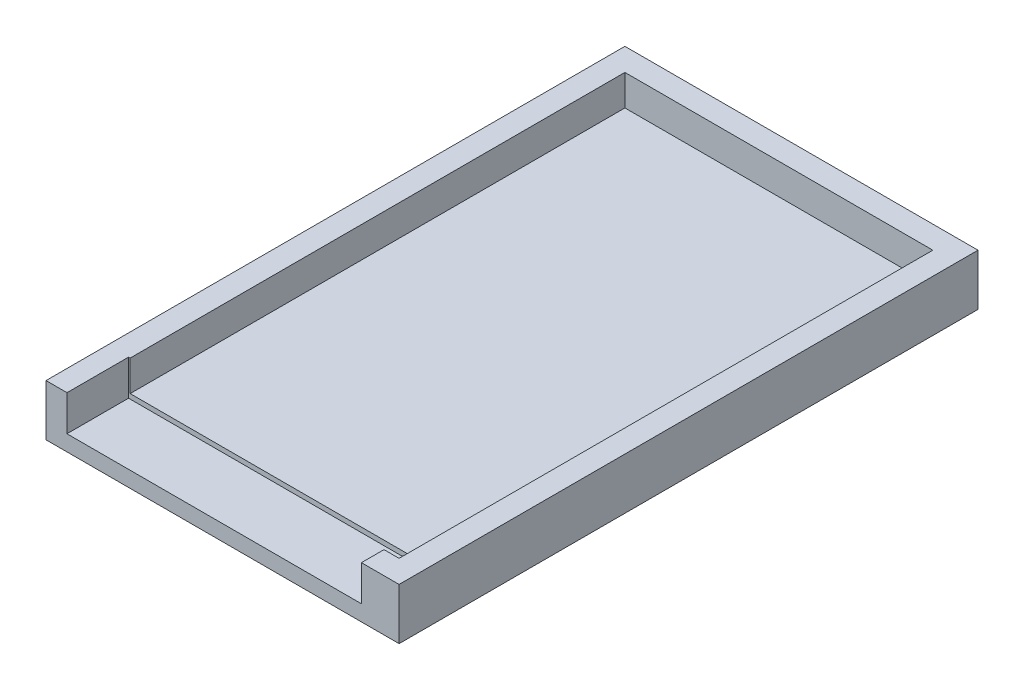
ISO-10303-21;
HEADER;
FILE_DESCRIPTION(('STEP AP214'),'2;1');
FILE_NAME('part.step','',(''),(''),'','','');
FILE_SCHEMA(('AUTOMOTIVE_DESIGN { 1 0 10303 214 1 1 1 1 }'));
ENDSEC;
DATA;
#1=APPLICATION_CONTEXT('core data for automotive mechanical design processes');
#2=APPLICATION_PROTOCOL_DEFINITION('international standard','automotive_design',2000,#1);
#3=PRODUCT_CONTEXT('',#1,'mechanical');
#4=PRODUCT('Part','Part','',(#3));
#5=PRODUCT_RELATED_PRODUCT_CATEGORY('part','',(#4));
#6=PRODUCT_DEFINITION_FORMATION('','',#4);
#7=PRODUCT_DEFINITION_CONTEXT('part definition',#1,'design');
#8=PRODUCT_DEFINITION('design','',#6,#7);
#9=PRODUCT_DEFINITION_SHAPE('','',#8);
#10=(LENGTH_UNIT() NAMED_UNIT(*) SI_UNIT(.MILLI.,.METRE.));
#11=(NAMED_UNIT(*) PLANE_ANGLE_UNIT() SI_UNIT($,.RADIAN.));
#12=(NAMED_UNIT(*) SI_UNIT($,.STERADIAN.) SOLID_ANGLE_UNIT());
#13=UNCERTAINTY_MEASURE_WITH_UNIT(LENGTH_MEASURE(1.E-05),#10,'distance_accuracy_value','');
#14=(GEOMETRIC_REPRESENTATION_CONTEXT(3) GLOBAL_UNCERTAINTY_ASSIGNED_CONTEXT((#13)) GLOBAL_UNIT_ASSIGNED_CONTEXT((#10,
#11,#12)) REPRESENTATION_CONTEXT('',''));
#15=CARTESIAN_POINT('',(0.,0.,0.));
#16=DIRECTION('',(0.,0.,1.));
#17=DIRECTION('',(1.,0.,0.));
#18=AXIS2_PLACEMENT_3D('',#15,#16,#17);
#19=CARTESIAN_POINT('',(0.,2.,0.));
#20=DIRECTION('',(0.,-1.,0.));
#21=DIRECTION('',(0.,0.,-1.));
#22=AXIS2_PLACEMENT_3D('',#19,#20,#21);
#23=PLANE('',#22);
#24=DIRECTION('',(1.,0.,0.));
#25=VECTOR('',#24,1.);
#26=CARTESIAN_POINT('',(0.,2.,22.2));
#27=LINE('',#26,#25);
#28=CARTESIAN_POINT('',(-15.,2.,22.2));
#29=VERTEX_POINT('',#28);
#30=CARTESIAN_POINT('',(13.5295329738902,2.,22.2));
#31=VERTEX_POINT('',#30);
#32=EDGE_CURVE('E172',#29,#31,#27,.T.);
#33=ORIENTED_EDGE('',*,*,#32,.T.);
#34=DIRECTION('',(0.,0.,1.));
#35=VECTOR('',#34,1.);
#36=CARTESIAN_POINT('',(13.5295329738902,2.,0.));
#37=LINE('',#36,#35);
#38=CARTESIAN_POINT('',(13.5295329738902,2.,26.));
#39=VERTEX_POINT('',#38);
#40=EDGE_CURVE('E167',#31,#39,#37,.T.);
#41=ORIENTED_EDGE('',*,*,#40,.T.);
#42=DIRECTION('',(1.,0.,0.));
#43=VECTOR('',#42,1.);
#44=CARTESIAN_POINT('',(-15.,2.,26.));
#45=LINE('',#44,#43);
#46=CARTESIAN_POINT('',(15.,2.,26.));
#47=VERTEX_POINT('',#46);
#48=EDGE_CURVE('E226',#39,#47,#45,.T.);
#49=ORIENTED_EDGE('',*,*,#48,.T.);
#50=DIRECTION('',(0.,0.,1.));
#51=VECTOR('',#50,1.);
#52=CARTESIAN_POINT('',(15.,2.,-26.));
#53=LINE('',#52,#51);
#54=CARTESIAN_POINT('',(15.,2.,-26.));
#55=VERTEX_POINT('',#54);
#56=EDGE_CURVE('E228',#55,#47,#53,.T.);
#57=ORIENTED_EDGE('',*,*,#56,.F.);
#58=DIRECTION('',(1.,0.,0.));
#59=VECTOR('',#58,1.);
#60=CARTESIAN_POINT('',(-15.,2.,-26.));
#61=LINE('',#60,#59);
#62=CARTESIAN_POINT('',(-15.,2.,-26.));
#63=VERTEX_POINT('',#62);
#64=EDGE_CURVE('E62',#63,#55,#61,.T.);
#65=ORIENTED_EDGE('',*,*,#64,.F.);
#66=DIRECTION('',(0.,0.,1.));
#67=VECTOR('',#66,1.);
#68=CARTESIAN_POINT('',(-15.,2.,-26.));
#69=LINE('',#68,#67);
#70=EDGE_CURVE('E232',#63,#29,#69,.T.);
#71=ORIENTED_EDGE('',*,*,#70,.T.);
#72=EDGE_LOOP('',(#33,#41,#49,#57,#65,#71));
#73=FACE_BOUND('',#72,.T.);
#74=ADVANCED_FACE('F39',(#73),#23,.F.);
#75=CARTESIAN_POINT('',(-15.,5.,-26.));
#76=DIRECTION('',(1.,0.,0.));
#77=DIRECTION('',(0.,0.,-1.));
#78=AXIS2_PLACEMENT_3D('',#75,#76,#77);
#79=PLANE('',#78);
#80=DIRECTION('',(0.,1.,0.));
#81=VECTOR('',#80,1.);
#82=CARTESIAN_POINT('',(-15.,5.,22.2));
#83=LINE('',#82,#81);
#84=CARTESIAN_POINT('',(-15.,5.,22.2));
#85=VERTEX_POINT('',#84);
#86=EDGE_CURVE('E170',#29,#85,#83,.T.);
#87=ORIENTED_EDGE('',*,*,#86,.F.);
#88=ORIENTED_EDGE('',*,*,#70,.F.);
#89=DIRECTION('',(0.,-1.,0.));
#90=VECTOR('',#89,1.);
#91=CARTESIAN_POINT('',(-15.,5.,-26.));
#92=LINE('',#91,#90);
#93=CARTESIAN_POINT('',(-15.,5.,-26.));
#94=VERTEX_POINT('',#93);
#95=EDGE_CURVE('E185',#94,#63,#92,.T.);
#96=ORIENTED_EDGE('',*,*,#95,.F.);
#97=DIRECTION('',(0.,0.,1.));
#98=VECTOR('',#97,1.);
#99=CARTESIAN_POINT('',(-15.,5.,-26.));
#100=LINE('',#99,#98);
#101=EDGE_CURVE('E175',#94,#85,#100,.T.);
#102=ORIENTED_EDGE('',*,*,#101,.T.);
#103=EDGE_LOOP('',(#87,#88,#96,#102));
#104=FACE_BOUND('',#103,.T.);
#105=ADVANCED_FACE('F268',(#104),#79,.T.);
#106=CARTESIAN_POINT('',(-15.,5.,26.));
#107=DIRECTION('',(0.,0.,-1.));
#108=DIRECTION('',(-1.,0.,0.));
#109=AXIS2_PLACEMENT_3D('',#106,#107,#108);
#110=PLANE('',#109);
#111=DIRECTION('',(0.,-1.,0.));
#112=VECTOR('',#111,1.);
#113=CARTESIAN_POINT('',(13.5295329738902,5.,26.));
#114=LINE('',#113,#112);
#115=CARTESIAN_POINT('',(13.5295329738902,5.,26.));
#116=VERTEX_POINT('',#115);
#117=EDGE_CURVE('E165',#116,#39,#114,.T.);
#118=ORIENTED_EDGE('',*,*,#117,.F.);
#119=DIRECTION('',(1.,0.,0.));
#120=VECTOR('',#119,1.);
#121=CARTESIAN_POINT('',(-15.,5.,26.));
#122=LINE('',#121,#120);
#123=CARTESIAN_POINT('',(15.,5.,26.));
#124=VERTEX_POINT('',#123);
#125=EDGE_CURVE('E178',#116,#124,#122,.T.);
#126=ORIENTED_EDGE('',*,*,#125,.T.);
#127=DIRECTION('',(0.,-1.,0.));
#128=VECTOR('',#127,1.);
#129=CARTESIAN_POINT('',(15.,5.,26.));
#130=LINE('',#129,#128);
#131=EDGE_CURVE('E191',#124,#47,#130,.T.);
#132=ORIENTED_EDGE('',*,*,#131,.T.);
#133=ORIENTED_EDGE('',*,*,#48,.F.);
#134=EDGE_LOOP('',(#118,#126,#132,#133));
#135=FACE_BOUND('',#134,.T.);
#136=ADVANCED_FACE('F273',(#135),#110,.T.);
#137=CARTESIAN_POINT('',(15.,5.,-26.));
#138=DIRECTION('',(-1.,0.,0.));
#139=DIRECTION('',(0.,0.,1.));
#140=AXIS2_PLACEMENT_3D('',#137,#138,#139);
#141=PLANE('',#140);
#142=ORIENTED_EDGE('',*,*,#56,.T.);
#143=ORIENTED_EDGE('',*,*,#131,.F.);
#144=DIRECTION('',(0.,0.,-1.));
#145=VECTOR('',#144,1.);
#146=CARTESIAN_POINT('',(15.,5.,-26.));
#147=LINE('',#146,#145);
#148=CARTESIAN_POINT('',(15.,5.,-26.));
#149=VERTEX_POINT('',#148);
#150=EDGE_CURVE('E180',#124,#149,#147,.T.);
#151=ORIENTED_EDGE('',*,*,#150,.T.);
#152=DIRECTION('',(0.,-1.,0.));
#153=VECTOR('',#152,1.);
#154=CARTESIAN_POINT('',(15.,5.,-26.));
#155=LINE('',#154,#153);
#156=EDGE_CURVE('E188',#149,#55,#155,.T.);
#157=ORIENTED_EDGE('',*,*,#156,.T.);
#158=EDGE_LOOP('',(#142,#143,#151,#157));
#159=FACE_BOUND('',#158,.T.);
#160=ADVANCED_FACE('F285',(#159),#141,.T.);
#161=CARTESIAN_POINT('',(-15.,5.,-26.));
#162=DIRECTION('',(0.,0.,1.));
#163=DIRECTION('',(1.,0.,0.));
#164=AXIS2_PLACEMENT_3D('',#161,#162,#163);
#165=PLANE('',#164);
#166=ORIENTED_EDGE('',*,*,#64,.T.);
#167=ORIENTED_EDGE('',*,*,#156,.F.);
#168=DIRECTION('',(-1.,0.,0.));
#169=VECTOR('',#168,1.);
#170=CARTESIAN_POINT('',(-15.,5.,-26.));
#171=LINE('',#170,#169);
#172=EDGE_CURVE('E183',#149,#94,#171,.T.);
#173=ORIENTED_EDGE('',*,*,#172,.T.);
#174=ORIENTED_EDGE('',*,*,#95,.T.);
#175=EDGE_LOOP('',(#166,#167,#173,#174));
#176=FACE_BOUND('',#175,.T.);
#177=ADVANCED_FACE('F265',(#176),#165,.T.);
#178=CARTESIAN_POINT('',(0.,5.,0.));
#179=DIRECTION('',(0.,-1.,0.));
#180=DIRECTION('',(0.,0.,-1.));
#181=AXIS2_PLACEMENT_3D('',#178,#179,#180);
#182=PLANE('',#181);
#183=ORIENTED_EDGE('',*,*,#125,.F.);
#184=DIRECTION('',(0.,0.,1.));
#185=VECTOR('',#184,1.);
#186=CARTESIAN_POINT('',(13.5295329738902,5.,0.));
#187=LINE('',#186,#185);
#188=CARTESIAN_POINT('',(13.5295329738902,5.,28.2));
#189=VERTEX_POINT('',#188);
#190=EDGE_CURVE('E162',#116,#189,#187,.T.);
#191=ORIENTED_EDGE('',*,*,#190,.T.);
#192=DIRECTION('',(1.,0.,0.));
#193=VECTOR('',#192,1.);
#194=CARTESIAN_POINT('',(-17.2,5.,28.2));
#195=LINE('',#194,#193);
#196=CARTESIAN_POINT('',(17.2,5.,28.2));
#197=VERTEX_POINT('',#196);
#198=EDGE_CURVE('E201',#189,#197,#195,.T.);
#199=ORIENTED_EDGE('',*,*,#198,.T.);
#200=DIRECTION('',(0.,0.,-1.));
#201=VECTOR('',#200,1.);
#202=CARTESIAN_POINT('',(17.2,5.,-28.2));
#203=LINE('',#202,#201);
#204=CARTESIAN_POINT('',(17.2,5.,-28.2));
#205=VERTEX_POINT('',#204);
#206=EDGE_CURVE('E205',#197,#205,#203,.T.);
#207=ORIENTED_EDGE('',*,*,#206,.T.);
#208=DIRECTION('',(-1.,0.,0.));
#209=VECTOR('',#208,1.);
#210=CARTESIAN_POINT('',(-17.2,5.,-28.2));
#211=LINE('',#210,#209);
#212=CARTESIAN_POINT('',(-17.2,5.,-28.2));
#213=VERTEX_POINT('',#212);
#214=EDGE_CURVE('E195',#205,#213,#211,.T.);
#215=ORIENTED_EDGE('',*,*,#214,.T.);
#216=DIRECTION('',(0.,0.,1.));
#217=VECTOR('',#216,1.);
#218=CARTESIAN_POINT('',(-17.2,5.,-28.2));
#219=LINE('',#218,#217);
#220=CARTESIAN_POINT('',(-17.2,5.,28.2));
#221=VERTEX_POINT('',#220);
#222=EDGE_CURVE('E198',#213,#221,#219,.T.);
#223=ORIENTED_EDGE('',*,*,#222,.T.);
#224=CARTESIAN_POINT('',(-15.1561862278402,5.,28.2));
#225=VERTEX_POINT('',#224);
#226=EDGE_CURVE('E202',#221,#225,#195,.T.);
#227=ORIENTED_EDGE('',*,*,#226,.T.);
#228=DIRECTION('',(0.,0.,-1.));
#229=VECTOR('',#228,1.);
#230=CARTESIAN_POINT('',(-15.1561862278402,5.,0.));
#231=LINE('',#230,#229);
#232=CARTESIAN_POINT('',(-15.1561862278402,5.,22.2));
#233=VERTEX_POINT('',#232);
#234=EDGE_CURVE('E54',#225,#233,#231,.T.);
#235=ORIENTED_EDGE('',*,*,#234,.T.);
#236=DIRECTION('',(1.,0.,0.));
#237=VECTOR('',#236,1.);
#238=CARTESIAN_POINT('',(0.,5.,22.2));
#239=LINE('',#238,#237);
#240=EDGE_CURVE('E11',#233,#85,#239,.T.);
#241=ORIENTED_EDGE('',*,*,#240,.T.);
#242=ORIENTED_EDGE('',*,*,#101,.F.);
#243=ORIENTED_EDGE('',*,*,#172,.F.);
#244=ORIENTED_EDGE('',*,*,#150,.F.);
#245=EDGE_LOOP('',(#183,#191,#199,#207,#215,#223,#227,#235,#241,#242,#243,#244));
#246=FACE_BOUND('',#245,.T.);
#247=ADVANCED_FACE('F240',(#246),#182,.F.);
#248=CARTESIAN_POINT('',(-17.2,5.,-28.2));
#249=DIRECTION('',(0.,0.,1.));
#250=DIRECTION('',(1.,0.,0.));
#251=AXIS2_PLACEMENT_3D('',#248,#249,#250);
#252=PLANE('',#251);
#253=DIRECTION('',(-1.,0.,0.));
#254=VECTOR('',#253,1.);
#255=CARTESIAN_POINT('',(-17.2,0.,-28.2));
#256=LINE('',#255,#254);
#257=CARTESIAN_POINT('',(17.2,0.,-28.2));
#258=VERTEX_POINT('',#257);
#259=CARTESIAN_POINT('',(-17.2,0.,-28.2));
#260=VERTEX_POINT('',#259);
#261=EDGE_CURVE('E194',#258,#260,#256,.T.);
#262=ORIENTED_EDGE('',*,*,#261,.T.);
#263=DIRECTION('',(0.,-1.,0.));
#264=VECTOR('',#263,1.);
#265=CARTESIAN_POINT('',(-17.2,5.,-28.2));
#266=LINE('',#265,#264);
#267=EDGE_CURVE('E223',#213,#260,#266,.T.);
#268=ORIENTED_EDGE('',*,*,#267,.F.);
#269=ORIENTED_EDGE('',*,*,#214,.F.);
#270=DIRECTION('',(0.,-1.,0.));
#271=VECTOR('',#270,1.);
#272=CARTESIAN_POINT('',(17.2,5.,-28.2));
#273=LINE('',#272,#271);
#274=EDGE_CURVE('E207',#205,#258,#273,.T.);
#275=ORIENTED_EDGE('',*,*,#274,.T.);
#276=EDGE_LOOP('',(#262,#268,#269,#275));
#277=FACE_BOUND('',#276,.T.);
#278=ADVANCED_FACE('F256',(#277),#252,.F.);
#279=CARTESIAN_POINT('',(-17.2,5.,-28.2));
#280=DIRECTION('',(1.,0.,0.));
#281=DIRECTION('',(0.,0.,-1.));
#282=AXIS2_PLACEMENT_3D('',#279,#280,#281);
#283=PLANE('',#282);
#284=DIRECTION('',(0.,0.,1.));
#285=VECTOR('',#284,1.);
#286=CARTESIAN_POINT('',(-17.2,0.,-28.2));
#287=LINE('',#286,#285);
#288=CARTESIAN_POINT('',(-17.2,0.,28.2));
#289=VERTEX_POINT('',#288);
#290=EDGE_CURVE('E210',#260,#289,#287,.T.);
#291=ORIENTED_EDGE('',*,*,#290,.T.);
#292=DIRECTION('',(0.,-1.,0.));
#293=VECTOR('',#292,1.);
#294=CARTESIAN_POINT('',(-17.2,5.,28.2));
#295=LINE('',#294,#293);
#296=EDGE_CURVE('E220',#221,#289,#295,.T.);
#297=ORIENTED_EDGE('',*,*,#296,.F.);
#298=ORIENTED_EDGE('',*,*,#222,.F.);
#299=ORIENTED_EDGE('',*,*,#267,.T.);
#300=EDGE_LOOP('',(#291,#297,#298,#299));
#301=FACE_BOUND('',#300,.T.);
#302=ADVANCED_FACE('F245',(#301),#283,.F.);
#303=CARTESIAN_POINT('',(-17.2,5.,28.2));
#304=DIRECTION('',(0.,0.,-1.));
#305=DIRECTION('',(-1.,0.,0.));
#306=AXIS2_PLACEMENT_3D('',#303,#304,#305);
#307=PLANE('',#306);
#308=ORIENTED_EDGE('',*,*,#198,.F.);
#309=DIRECTION('',(0.,1.,0.));
#310=VECTOR('',#309,1.);
#311=CARTESIAN_POINT('',(13.5295329738902,5.90719360037341,28.2));
#312=LINE('',#311,#310);
#313=CARTESIAN_POINT('',(13.5295329738902,1.53233336391279,28.2));
#314=VERTEX_POINT('',#313);
#315=EDGE_CURVE('E156',#314,#189,#312,.T.);
#316=ORIENTED_EDGE('',*,*,#315,.F.);
#317=DIRECTION('',(1.,0.,0.));
#318=VECTOR('',#317,1.);
#319=CARTESIAN_POINT('',(13.5295329738902,1.53233336391279,28.2));
#320=LINE('',#319,#318);
#321=CARTESIAN_POINT('',(-15.1561862278402,1.53233336391279,28.2));
#322=VERTEX_POINT('',#321);
#323=EDGE_CURVE('E158',#322,#314,#320,.T.);
#324=ORIENTED_EDGE('',*,*,#323,.F.);
#325=DIRECTION('',(0.,1.,0.));
#326=VECTOR('',#325,1.);
#327=CARTESIAN_POINT('',(-15.1561862278402,5.,28.2));
#328=LINE('',#327,#326);
#329=EDGE_CURVE('E47',#322,#225,#328,.T.);
#330=ORIENTED_EDGE('',*,*,#329,.T.);
#331=ORIENTED_EDGE('',*,*,#226,.F.);
#332=ORIENTED_EDGE('',*,*,#296,.T.);
#333=DIRECTION('',(1.,0.,0.));
#334=VECTOR('',#333,1.);
#335=CARTESIAN_POINT('',(-17.2,0.,28.2));
#336=LINE('',#335,#334);
#337=CARTESIAN_POINT('',(17.2,0.,28.2));
#338=VERTEX_POINT('',#337);
#339=EDGE_CURVE('E212',#289,#338,#336,.T.);
#340=ORIENTED_EDGE('',*,*,#339,.T.);
#341=DIRECTION('',(0.,-1.,0.));
#342=VECTOR('',#341,1.);
#343=CARTESIAN_POINT('',(17.2,5.,28.2));
#344=LINE('',#343,#342);
#345=EDGE_CURVE('E217',#197,#338,#344,.T.);
#346=ORIENTED_EDGE('',*,*,#345,.F.);
#347=EDGE_LOOP('',(#308,#316,#324,#330,#331,#332,#340,#346));
#348=FACE_BOUND('',#347,.T.);
#349=ADVANCED_FACE('F236',(#348),#307,.F.);
#350=CARTESIAN_POINT('',(17.2,5.,-28.2));
#351=DIRECTION('',(-1.,0.,0.));
#352=DIRECTION('',(0.,0.,1.));
#353=AXIS2_PLACEMENT_3D('',#350,#351,#352);
#354=PLANE('',#353);
#355=DIRECTION('',(0.,0.,-1.));
#356=VECTOR('',#355,1.);
#357=CARTESIAN_POINT('',(17.2,0.,-28.2));
#358=LINE('',#357,#356);
#359=EDGE_CURVE('E199',#338,#258,#358,.T.);
#360=ORIENTED_EDGE('',*,*,#359,.T.);
#361=ORIENTED_EDGE('',*,*,#274,.F.);
#362=ORIENTED_EDGE('',*,*,#206,.F.);
#363=ORIENTED_EDGE('',*,*,#345,.T.);
#364=EDGE_LOOP('',(#360,#361,#362,#363));
#365=FACE_BOUND('',#364,.T.);
#366=ADVANCED_FACE('F253',(#365),#354,.F.);
#367=CARTESIAN_POINT('',(0.,0.,0.));
#368=DIRECTION('',(0.,-1.,0.));
#369=DIRECTION('',(0.,0.,-1.));
#370=AXIS2_PLACEMENT_3D('',#367,#368,#369);
#371=PLANE('',#370);
#372=ORIENTED_EDGE('',*,*,#261,.F.);
#373=ORIENTED_EDGE('',*,*,#359,.F.);
#374=ORIENTED_EDGE('',*,*,#339,.F.);
#375=ORIENTED_EDGE('',*,*,#290,.F.);
#376=EDGE_LOOP('',(#372,#373,#374,#375));
#377=FACE_BOUND('',#376,.T.);
#378=ADVANCED_FACE('F41',(#377),#371,.T.);
#379=CARTESIAN_POINT('',(0.,0.,22.2));
#380=DIRECTION('',(0.,0.,-1.));
#381=DIRECTION('',(-1.,0.,0.));
#382=AXIS2_PLACEMENT_3D('',#379,#380,#381);
#383=PLANE('',#382);
#384=ORIENTED_EDGE('',*,*,#86,.T.);
#385=ORIENTED_EDGE('',*,*,#240,.F.);
#386=DIRECTION('',(0.,-1.,0.));
#387=VECTOR('',#386,1.);
#388=CARTESIAN_POINT('',(-15.1561862278402,5.90719360037341,22.2));
#389=LINE('',#388,#387);
#390=CARTESIAN_POINT('',(-15.1561862278402,1.53233336391279,22.2));
#391=VERTEX_POINT('',#390);
#392=EDGE_CURVE('E135',#233,#391,#389,.T.);
#393=ORIENTED_EDGE('',*,*,#392,.T.);
#394=DIRECTION('',(1.,0.,0.));
#395=VECTOR('',#394,1.);
#396=CARTESIAN_POINT('',(13.5295329738902,1.53233336391279,22.2));
#397=LINE('',#396,#395);
#398=CARTESIAN_POINT('',(13.5295329738902,1.53233336391279,22.2));
#399=VERTEX_POINT('',#398);
#400=EDGE_CURVE('E140',#391,#399,#397,.T.);
#401=ORIENTED_EDGE('',*,*,#400,.T.);
#402=DIRECTION('',(0.,1.,0.));
#403=VECTOR('',#402,1.);
#404=CARTESIAN_POINT('',(13.5295329738902,5.90719360037341,22.2));
#405=LINE('',#404,#403);
#406=EDGE_CURVE('E141',#399,#31,#405,.T.);
#407=ORIENTED_EDGE('',*,*,#406,.T.);
#408=ORIENTED_EDGE('',*,*,#32,.F.);
#409=EDGE_LOOP('',(#384,#385,#393,#401,#407,#408));
#410=FACE_BOUND('',#409,.T.);
#411=ADVANCED_FACE('F137',(#410),#383,.F.);
#412=CARTESIAN_POINT('',(13.5295329738902,5.90719360037341,22.2));
#413=DIRECTION('',(1.,0.,0.));
#414=DIRECTION('',(0.,0.,-1.));
#415=AXIS2_PLACEMENT_3D('',#412,#413,#414);
#416=PLANE('',#415);
#417=ORIENTED_EDGE('',*,*,#406,.F.);
#418=DIRECTION('',(0.,0.,1.));
#419=VECTOR('',#418,1.);
#420=CARTESIAN_POINT('',(13.5295329738902,1.53233336391279,22.2));
#421=LINE('',#420,#419);
#422=EDGE_CURVE('E149',#399,#314,#421,.T.);
#423=ORIENTED_EDGE('',*,*,#422,.T.);
#424=ORIENTED_EDGE('',*,*,#315,.T.);
#425=ORIENTED_EDGE('',*,*,#190,.F.);
#426=ORIENTED_EDGE('',*,*,#117,.T.);
#427=ORIENTED_EDGE('',*,*,#40,.F.);
#428=EDGE_LOOP('',(#417,#423,#424,#425,#426,#427));
#429=FACE_BOUND('',#428,.T.);
#430=ADVANCED_FACE('F289',(#429),#416,.F.);
#431=CARTESIAN_POINT('',(-15.1561862278402,5.90719360037341,22.2));
#432=DIRECTION('',(-1.,0.,0.));
#433=DIRECTION('',(0.,0.,1.));
#434=AXIS2_PLACEMENT_3D('',#431,#432,#433);
#435=PLANE('',#434);
#436=ORIENTED_EDGE('',*,*,#329,.F.);
#437=DIRECTION('',(0.,0.,1.));
#438=VECTOR('',#437,1.);
#439=CARTESIAN_POINT('',(-15.1561862278402,1.53233336391279,22.2));
#440=LINE('',#439,#438);
#441=EDGE_CURVE('E144',#391,#322,#440,.T.);
#442=ORIENTED_EDGE('',*,*,#441,.F.);
#443=ORIENTED_EDGE('',*,*,#392,.F.);
#444=ORIENTED_EDGE('',*,*,#234,.F.);
#445=EDGE_LOOP('',(#436,#442,#443,#444));
#446=FACE_BOUND('',#445,.T.);
#447=ADVANCED_FACE('F145',(#446),#435,.F.);
#448=CARTESIAN_POINT('',(13.5295329738902,1.53233336391279,22.2));
#449=DIRECTION('',(0.,-1.,0.));
#450=DIRECTION('',(0.,0.,-1.));
#451=AXIS2_PLACEMENT_3D('',#448,#449,#450);
#452=PLANE('',#451);
#453=ORIENTED_EDGE('',*,*,#323,.T.);
#454=ORIENTED_EDGE('',*,*,#422,.F.);
#455=ORIENTED_EDGE('',*,*,#400,.F.);
#456=ORIENTED_EDGE('',*,*,#441,.T.);
#457=EDGE_LOOP('',(#453,#454,#455,#456));
#458=FACE_BOUND('',#457,.T.);
#459=ADVANCED_FACE('F151',(#458),#452,.F.);
#460=CLOSED_SHELL('',(#74,#105,#136,#160,#177,#247,#278,#302,#349,#366,#378,#411,#430,#447,#459));
#461=MANIFOLD_SOLID_BREP('B2',#460);
#462=ADVANCED_BREP_SHAPE_REPRESENTATION('',(#18,#461),#14);
#463=SHAPE_DEFINITION_REPRESENTATION(#9,#462);
ENDSEC;
END-ISO-10303-21;
